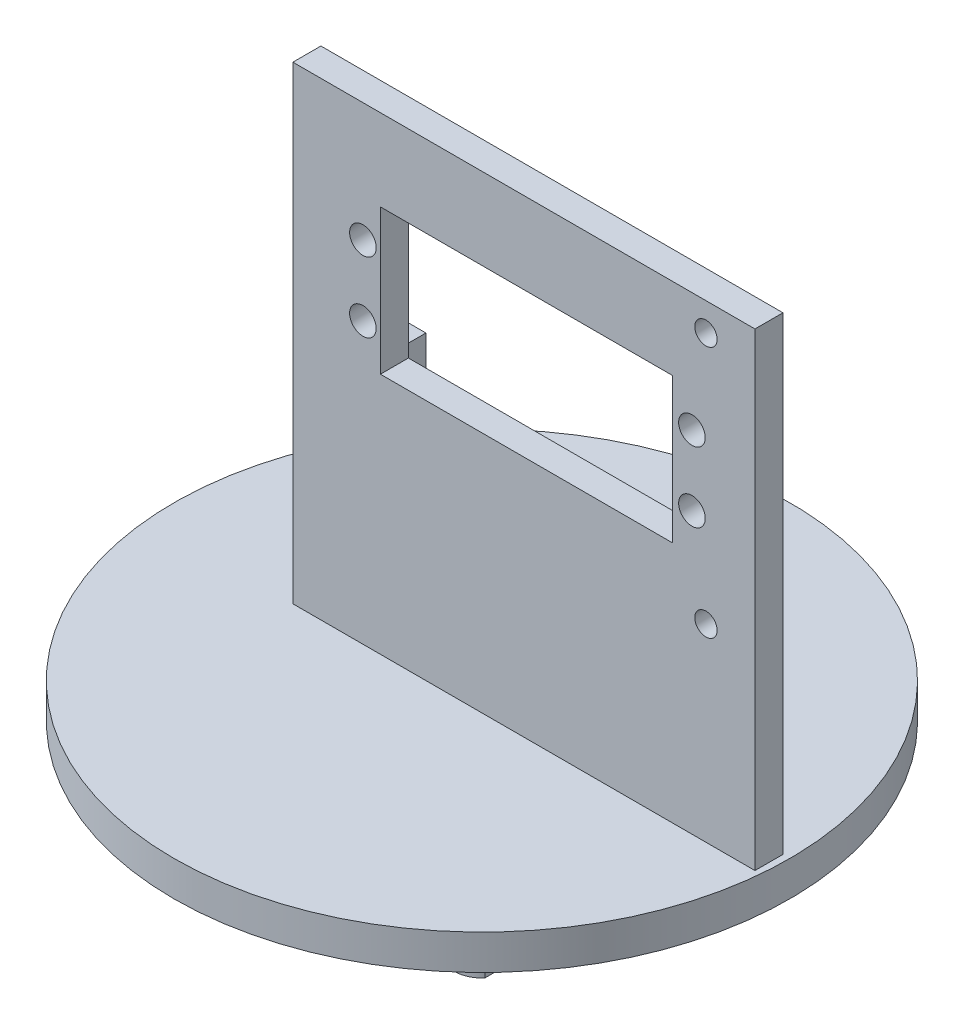
ISO-10303-21;
HEADER;
FILE_DESCRIPTION(('STEP AP214'),'2;1');
FILE_NAME('part.step','',(''),(''),'','','');
FILE_SCHEMA(('AUTOMOTIVE_DESIGN { 1 0 10303 214 1 1 1 1 }'));
ENDSEC;
DATA;
#1=APPLICATION_CONTEXT('core data for automotive mechanical design processes');
#2=APPLICATION_PROTOCOL_DEFINITION('international standard','automotive_design',2000,#1);
#3=PRODUCT_CONTEXT('',#1,'mechanical');
#4=PRODUCT('Part','Part','',(#3));
#5=PRODUCT_RELATED_PRODUCT_CATEGORY('part','',(#4));
#6=PRODUCT_DEFINITION_FORMATION('','',#4);
#7=PRODUCT_DEFINITION_CONTEXT('part definition',#1,'design');
#8=PRODUCT_DEFINITION('design','',#6,#7);
#9=PRODUCT_DEFINITION_SHAPE('','',#8);
#10=(LENGTH_UNIT() NAMED_UNIT(*) SI_UNIT(.MILLI.,.METRE.));
#11=(NAMED_UNIT(*) PLANE_ANGLE_UNIT() SI_UNIT($,.RADIAN.));
#12=(NAMED_UNIT(*) SI_UNIT($,.STERADIAN.) SOLID_ANGLE_UNIT());
#13=UNCERTAINTY_MEASURE_WITH_UNIT(LENGTH_MEASURE(1.E-05),#10,'distance_accuracy_value','');
#14=(GEOMETRIC_REPRESENTATION_CONTEXT(3) GLOBAL_UNCERTAINTY_ASSIGNED_CONTEXT((#13)) GLOBAL_UNIT_ASSIGNED_CONTEXT((#10,
#11,#12)) REPRESENTATION_CONTEXT('',''));
#15=CARTESIAN_POINT('',(0.,0.,0.));
#16=DIRECTION('',(0.,0.,1.));
#17=DIRECTION('',(1.,0.,0.));
#18=AXIS2_PLACEMENT_3D('',#15,#16,#17);
#19=CARTESIAN_POINT('',(0.,0.,0.));
#20=DIRECTION('',(0.,0.,-1.));
#21=DIRECTION('',(-1.,0.,0.));
#22=AXIS2_PLACEMENT_3D('',#19,#20,#21);
#23=PLANE('',#22);
#24=CARTESIAN_POINT('',(36.,104.,0.));
#25=DIRECTION('',(0.,0.,-1.));
#26=DIRECTION('',(-1.,0.,0.));
#27=AXIS2_PLACEMENT_3D('',#24,#25,#26);
#28=CIRCLE('',#27,1.6);
#29=CARTESIAN_POINT('',(34.4,104.,0.));
#30=VERTEX_POINT('',#29);
#31=EDGE_CURVE('E189',#30,#30,#28,.F.);
#32=ORIENTED_EDGE('',*,*,#31,.T.);
#33=EDGE_LOOP('',(#32));
#34=FACE_BOUND('',#33,.T.);
#35=CARTESIAN_POINT('',(36.,140.,0.));
#36=DIRECTION('',(0.,0.,-1.));
#37=DIRECTION('',(-1.,0.,0.));
#38=AXIS2_PLACEMENT_3D('',#35,#36,#37);
#39=CIRCLE('',#38,1.6);
#40=CARTESIAN_POINT('',(34.4,140.,0.));
#41=VERTEX_POINT('',#40);
#42=EDGE_CURVE('E183',#41,#41,#39,.F.);
#43=ORIENTED_EDGE('',*,*,#42,.T.);
#44=EDGE_LOOP('',(#43));
#45=FACE_BOUND('',#44,.T.);
#46=CARTESIAN_POINT('',(-13.,127.,0.));
#47=DIRECTION('',(0.,0.,-1.));
#48=DIRECTION('',(-1.,0.,0.));
#49=AXIS2_PLACEMENT_3D('',#46,#47,#48);
#50=CIRCLE('',#49,1.9);
#51=CARTESIAN_POINT('',(-14.9,127.,0.));
#52=VERTEX_POINT('',#51);
#53=EDGE_CURVE('E209',#52,#52,#50,.F.);
#54=ORIENTED_EDGE('',*,*,#53,.T.);
#55=EDGE_LOOP('',(#54));
#56=FACE_BOUND('',#55,.T.);
#57=CARTESIAN_POINT('',(34.,117.,0.));
#58=DIRECTION('',(0.,0.,-1.));
#59=DIRECTION('',(-1.,0.,0.));
#60=AXIS2_PLACEMENT_3D('',#57,#58,#59);
#61=CIRCLE('',#60,1.9);
#62=CARTESIAN_POINT('',(32.1,117.,0.));
#63=VERTEX_POINT('',#62);
#64=EDGE_CURVE('E202',#63,#63,#61,.F.);
#65=ORIENTED_EDGE('',*,*,#64,.T.);
#66=EDGE_LOOP('',(#65));
#67=FACE_BOUND('',#66,.T.);
#68=CARTESIAN_POINT('',(34.,127.,0.));
#69=DIRECTION('',(0.,0.,-1.));
#70=DIRECTION('',(-1.,0.,0.));
#71=AXIS2_PLACEMENT_3D('',#68,#69,#70);
#72=CIRCLE('',#71,1.9);
#73=CARTESIAN_POINT('',(32.1,127.,0.));
#74=VERTEX_POINT('',#73);
#75=EDGE_CURVE('E199',#74,#74,#72,.F.);
#76=ORIENTED_EDGE('',*,*,#75,.T.);
#77=EDGE_LOOP('',(#76));
#78=FACE_BOUND('',#77,.T.);
#79=CARTESIAN_POINT('',(-13.,117.,0.));
#80=DIRECTION('',(0.,0.,-1.));
#81=DIRECTION('',(-1.,0.,0.));
#82=AXIS2_PLACEMENT_3D('',#79,#80,#81);
#83=CIRCLE('',#82,1.9);
#84=CARTESIAN_POINT('',(-14.9,117.,0.));
#85=VERTEX_POINT('',#84);
#86=EDGE_CURVE('E193',#85,#85,#83,.F.);
#87=ORIENTED_EDGE('',*,*,#86,.T.);
#88=EDGE_LOOP('',(#87));
#89=FACE_BOUND('',#88,.T.);
#90=DIRECTION('',(-1.,0.,0.));
#91=VECTOR('',#90,1.);
#92=CARTESIAN_POINT('',(0.,132.35,0.));
#93=LINE('',#92,#91);
#94=CARTESIAN_POINT('',(31.2,132.35,0.));
#95=VERTEX_POINT('',#94);
#96=CARTESIAN_POINT('',(-10.5,132.35,0.));
#97=VERTEX_POINT('',#96);
#98=EDGE_CURVE('E326',#95,#97,#93,.T.);
#99=ORIENTED_EDGE('',*,*,#98,.T.);
#100=DIRECTION('',(0.,-1.,0.));
#101=VECTOR('',#100,1.);
#102=CARTESIAN_POINT('',(-10.5,0.,0.));
#103=LINE('',#102,#101);
#104=CARTESIAN_POINT('',(-10.5,111.65,0.));
#105=VERTEX_POINT('',#104);
#106=EDGE_CURVE('E185',#97,#105,#103,.T.);
#107=ORIENTED_EDGE('',*,*,#106,.T.);
#108=DIRECTION('',(1.,0.,0.));
#109=VECTOR('',#108,1.);
#110=CARTESIAN_POINT('',(0.,111.65,0.));
#111=LINE('',#110,#109);
#112=CARTESIAN_POINT('',(31.2,111.65,0.));
#113=VERTEX_POINT('',#112);
#114=EDGE_CURVE('E331',#105,#113,#111,.T.);
#115=ORIENTED_EDGE('',*,*,#114,.T.);
#116=DIRECTION('',(0.,1.,0.));
#117=VECTOR('',#116,1.);
#118=CARTESIAN_POINT('',(31.2,0.,0.));
#119=LINE('',#118,#117);
#120=EDGE_CURVE('E329',#113,#95,#119,.T.);
#121=ORIENTED_EDGE('',*,*,#120,.T.);
#122=EDGE_LOOP('',(#99,#107,#115,#121));
#123=FACE_BOUND('',#122,.T.);
#124=DIRECTION('',(-1.,0.,0.));
#125=VECTOR('',#124,1.);
#126=CARTESIAN_POINT('',(0.,77.,0.));
#127=LINE('',#126,#125);
#128=CARTESIAN_POINT('',(43.,77.,0.));
#129=VERTEX_POINT('',#128);
#130=CARTESIAN_POINT('',(-16.,77.,0.));
#131=VERTEX_POINT('',#130);
#132=EDGE_CURVE('E317',#129,#131,#127,.T.);
#133=ORIENTED_EDGE('',*,*,#132,.T.);
#134=DIRECTION('',(0.,1.,0.));
#135=VECTOR('',#134,1.);
#136=CARTESIAN_POINT('',(-16.,0.,0.));
#137=LINE('',#136,#135);
#138=CARTESIAN_POINT('',(-16.,108.,0.));
#139=VERTEX_POINT('',#138);
#140=EDGE_CURVE('E58',#131,#139,#137,.T.);
#141=ORIENTED_EDGE('',*,*,#140,.T.);
#142=DIRECTION('',(-1.,0.,0.));
#143=VECTOR('',#142,1.);
#144=CARTESIAN_POINT('',(0.,108.,0.));
#145=LINE('',#144,#143);
#146=CARTESIAN_POINT('',(-23.,108.,0.));
#147=VERTEX_POINT('',#146);
#148=EDGE_CURVE('E11',#139,#147,#145,.T.);
#149=ORIENTED_EDGE('',*,*,#148,.T.);
#150=DIRECTION('',(0.,-1.,0.));
#151=VECTOR('',#150,1.);
#152=CARTESIAN_POINT('',(-23.,76.,0.));
#153=LINE('',#152,#151);
#154=CARTESIAN_POINT('',(-23.,144.,0.));
#155=VERTEX_POINT('',#154);
#156=EDGE_CURVE('E242',#155,#147,#153,.T.);
#157=ORIENTED_EDGE('',*,*,#156,.F.);
#158=DIRECTION('',(-1.,0.,0.));
#159=VECTOR('',#158,1.);
#160=CARTESIAN_POINT('',(-23.,144.,0.));
#161=LINE('',#160,#159);
#162=CARTESIAN_POINT('',(43.,144.,0.));
#163=VERTEX_POINT('',#162);
#164=EDGE_CURVE('E249',#163,#155,#161,.T.);
#165=ORIENTED_EDGE('',*,*,#164,.F.);
#166=DIRECTION('',(0.,1.,0.));
#167=VECTOR('',#166,1.);
#168=CARTESIAN_POINT('',(43.,76.,0.));
#169=LINE('',#168,#167);
#170=EDGE_CURVE('E260',#129,#163,#169,.T.);
#171=ORIENTED_EDGE('',*,*,#170,.F.);
#172=EDGE_LOOP('',(#133,#141,#149,#157,#165,#171));
#173=FACE_BOUND('',#172,.T.);
#174=ADVANCED_FACE('F44',(#34,#45,#56,#67,#78,#89,#123,#173),#23,.T.);
#175=CARTESIAN_POINT('',(0.,0.,4.));
#176=DIRECTION('',(0.,0.,-1.));
#177=DIRECTION('',(-1.,0.,0.));
#178=AXIS2_PLACEMENT_3D('',#175,#176,#177);
#179=PLANE('',#178);
#180=DIRECTION('',(0.,-1.,0.));
#181=VECTOR('',#180,1.);
#182=CARTESIAN_POINT('',(-23.,76.,4.));
#183=LINE('',#182,#181);
#184=CARTESIAN_POINT('',(-23.,144.,4.));
#185=VERTEX_POINT('',#184);
#186=CARTESIAN_POINT('',(-23.,77.,4.));
#187=VERTEX_POINT('',#186);
#188=EDGE_CURVE('E243',#185,#187,#183,.T.);
#189=ORIENTED_EDGE('',*,*,#188,.T.);
#190=DIRECTION('',(-1.,0.,0.));
#191=VECTOR('',#190,1.);
#192=CARTESIAN_POINT('',(0.,77.,4.));
#193=LINE('',#192,#191);
#194=CARTESIAN_POINT('',(43.,77.,4.));
#195=VERTEX_POINT('',#194);
#196=EDGE_CURVE('E144',#195,#187,#193,.T.);
#197=ORIENTED_EDGE('',*,*,#196,.F.);
#198=DIRECTION('',(0.,1.,0.));
#199=VECTOR('',#198,1.);
#200=CARTESIAN_POINT('',(43.,76.,4.));
#201=LINE('',#200,#199);
#202=CARTESIAN_POINT('',(43.,144.,4.));
#203=VERTEX_POINT('',#202);
#204=EDGE_CURVE('E250',#195,#203,#201,.T.);
#205=ORIENTED_EDGE('',*,*,#204,.T.);
#206=DIRECTION('',(-1.,0.,0.));
#207=VECTOR('',#206,1.);
#208=CARTESIAN_POINT('',(-23.,144.,4.));
#209=LINE('',#208,#207);
#210=EDGE_CURVE('E253',#203,#185,#209,.T.);
#211=ORIENTED_EDGE('',*,*,#210,.T.);
#212=EDGE_LOOP('',(#189,#197,#205,#211));
#213=FACE_BOUND('',#212,.T.);
#214=DIRECTION('',(0.,-1.,0.));
#215=VECTOR('',#214,1.);
#216=CARTESIAN_POINT('',(-10.5,0.,4.));
#217=LINE('',#216,#215);
#218=CARTESIAN_POINT('',(-10.5,132.35,4.));
#219=VERTEX_POINT('',#218);
#220=CARTESIAN_POINT('',(-10.5,111.65,4.));
#221=VERTEX_POINT('',#220);
#222=EDGE_CURVE('E238',#219,#221,#217,.T.);
#223=ORIENTED_EDGE('',*,*,#222,.F.);
#224=DIRECTION('',(-1.,0.,0.));
#225=VECTOR('',#224,1.);
#226=CARTESIAN_POINT('',(0.,132.35,4.));
#227=LINE('',#226,#225);
#228=CARTESIAN_POINT('',(31.2,132.35,4.));
#229=VERTEX_POINT('',#228);
#230=EDGE_CURVE('E229',#229,#219,#227,.T.);
#231=ORIENTED_EDGE('',*,*,#230,.F.);
#232=DIRECTION('',(0.,1.,0.));
#233=VECTOR('',#232,1.);
#234=CARTESIAN_POINT('',(31.2,0.,4.));
#235=LINE('',#234,#233);
#236=CARTESIAN_POINT('',(31.2,111.65,4.));
#237=VERTEX_POINT('',#236);
#238=EDGE_CURVE('E234',#237,#229,#235,.T.);
#239=ORIENTED_EDGE('',*,*,#238,.F.);
#240=DIRECTION('',(1.,0.,0.));
#241=VECTOR('',#240,1.);
#242=CARTESIAN_POINT('',(0.,111.65,4.));
#243=LINE('',#242,#241);
#244=EDGE_CURVE('E240',#221,#237,#243,.T.);
#245=ORIENTED_EDGE('',*,*,#244,.F.);
#246=EDGE_LOOP('',(#223,#231,#239,#245));
#247=FACE_BOUND('',#246,.T.);
#248=CARTESIAN_POINT('',(-13.,117.,4.));
#249=DIRECTION('',(0.,0.,-1.));
#250=DIRECTION('',(-1.,0.,0.));
#251=AXIS2_PLACEMENT_3D('',#248,#249,#250);
#252=CIRCLE('',#251,1.9);
#253=CARTESIAN_POINT('',(-14.9,117.,4.));
#254=VERTEX_POINT('',#253);
#255=EDGE_CURVE('E198',#254,#254,#252,.F.);
#256=ORIENTED_EDGE('',*,*,#255,.F.);
#257=EDGE_LOOP('',(#256));
#258=FACE_BOUND('',#257,.T.);
#259=CARTESIAN_POINT('',(34.,127.,4.));
#260=DIRECTION('',(0.,0.,-1.));
#261=DIRECTION('',(-1.,0.,0.));
#262=AXIS2_PLACEMENT_3D('',#259,#260,#261);
#263=CIRCLE('',#262,1.9);
#264=CARTESIAN_POINT('',(32.1,127.,4.));
#265=VERTEX_POINT('',#264);
#266=EDGE_CURVE('E203',#265,#265,#263,.F.);
#267=ORIENTED_EDGE('',*,*,#266,.F.);
#268=EDGE_LOOP('',(#267));
#269=FACE_BOUND('',#268,.T.);
#270=CARTESIAN_POINT('',(34.,117.,4.));
#271=DIRECTION('',(0.,0.,-1.));
#272=DIRECTION('',(-1.,0.,0.));
#273=AXIS2_PLACEMENT_3D('',#270,#271,#272);
#274=CIRCLE('',#273,1.9);
#275=CARTESIAN_POINT('',(32.1,117.,4.));
#276=VERTEX_POINT('',#275);
#277=EDGE_CURVE('E206',#276,#276,#274,.F.);
#278=ORIENTED_EDGE('',*,*,#277,.F.);
#279=EDGE_LOOP('',(#278));
#280=FACE_BOUND('',#279,.T.);
#281=CARTESIAN_POINT('',(-13.,127.,4.));
#282=DIRECTION('',(0.,0.,-1.));
#283=DIRECTION('',(-1.,0.,0.));
#284=AXIS2_PLACEMENT_3D('',#281,#282,#283);
#285=CIRCLE('',#284,1.9);
#286=CARTESIAN_POINT('',(-14.9,127.,4.));
#287=VERTEX_POINT('',#286);
#288=EDGE_CURVE('E211',#287,#287,#285,.F.);
#289=ORIENTED_EDGE('',*,*,#288,.F.);
#290=EDGE_LOOP('',(#289));
#291=FACE_BOUND('',#290,.T.);
#292=CARTESIAN_POINT('',(36.,140.,4.));
#293=DIRECTION('',(0.,0.,-1.));
#294=DIRECTION('',(-1.,0.,0.));
#295=AXIS2_PLACEMENT_3D('',#292,#293,#294);
#296=CIRCLE('',#295,1.6);
#297=CARTESIAN_POINT('',(34.4,140.,4.));
#298=VERTEX_POINT('',#297);
#299=EDGE_CURVE('E186',#298,#298,#296,.F.);
#300=ORIENTED_EDGE('',*,*,#299,.F.);
#301=EDGE_LOOP('',(#300));
#302=FACE_BOUND('',#301,.T.);
#303=CARTESIAN_POINT('',(36.,104.,4.));
#304=DIRECTION('',(0.,0.,-1.));
#305=DIRECTION('',(-1.,0.,0.));
#306=AXIS2_PLACEMENT_3D('',#303,#304,#305);
#307=CIRCLE('',#306,1.6);
#308=CARTESIAN_POINT('',(34.4,104.,4.));
#309=VERTEX_POINT('',#308);
#310=EDGE_CURVE('E192',#309,#309,#307,.F.);
#311=ORIENTED_EDGE('',*,*,#310,.F.);
#312=EDGE_LOOP('',(#311));
#313=FACE_BOUND('',#312,.T.);
#314=ADVANCED_FACE('F369',(#213,#247,#258,#269,#280,#291,#302,#313),#179,.F.);
#315=CARTESIAN_POINT('',(0.,77.,0.));
#316=DIRECTION('',(0.,1.,0.));
#317=DIRECTION('',(0.,0.,1.));
#318=AXIS2_PLACEMENT_3D('',#315,#316,#317);
#319=PLANE('',#318);
#320=DIRECTION('',(0.,0.,-1.));
#321=VECTOR('',#320,1.);
#322=CARTESIAN_POINT('',(-16.,77.,4.));
#323=LINE('',#322,#321);
#324=CARTESIAN_POINT('',(-16.,77.,-8.));
#325=VERTEX_POINT('',#324);
#326=EDGE_CURVE('E53',#131,#325,#323,.T.);
#327=ORIENTED_EDGE('',*,*,#326,.F.);
#328=ORIENTED_EDGE('',*,*,#132,.F.);
#329=DIRECTION('',(0.,0.,1.));
#330=VECTOR('',#329,1.);
#331=CARTESIAN_POINT('',(43.,77.,0.));
#332=LINE('',#331,#330);
#333=EDGE_CURVE('E151',#129,#195,#332,.T.);
#334=ORIENTED_EDGE('',*,*,#333,.T.);
#335=ORIENTED_EDGE('',*,*,#196,.T.);
#336=DIRECTION('',(0.,0.,-1.));
#337=VECTOR('',#336,1.);
#338=CARTESIAN_POINT('',(-23.,77.,0.));
#339=LINE('',#338,#337);
#340=CARTESIAN_POINT('',(-23.,77.,-8.));
#341=VERTEX_POINT('',#340);
#342=EDGE_CURVE('E139',#187,#341,#339,.T.);
#343=ORIENTED_EDGE('',*,*,#342,.T.);
#344=DIRECTION('',(1.,0.,0.));
#345=VECTOR('',#344,1.);
#346=CARTESIAN_POINT('',(-23.,77.,-8.));
#347=LINE('',#346,#345);
#348=EDGE_CURVE('E142',#341,#325,#347,.T.);
#349=ORIENTED_EDGE('',*,*,#348,.T.);
#350=EDGE_LOOP('',(#327,#328,#334,#335,#343,#349));
#351=FACE_BOUND('',#350,.T.);
#352=CARTESIAN_POINT('',(0.,77.,0.));
#353=DIRECTION('',(0.,1.,0.));
#354=DIRECTION('',(0.,0.,1.));
#355=AXIS2_PLACEMENT_3D('',#352,#353,#354);
#356=CIRCLE('',#355,44.);
#357=CARTESIAN_POINT('',(0.,77.,44.));
#358=VERTEX_POINT('',#357);
#359=EDGE_CURVE('E298',#358,#358,#356,.T.);
#360=ORIENTED_EDGE('',*,*,#359,.T.);
#361=EDGE_LOOP('',(#360));
#362=FACE_BOUND('',#361,.T.);
#363=ADVANCED_FACE('F138',(#351,#362),#319,.T.);
#364=CARTESIAN_POINT('',(0.,72.,0.));
#365=DIRECTION('',(0.,-1.,0.));
#366=DIRECTION('',(0.,0.,-1.));
#367=AXIS2_PLACEMENT_3D('',#364,#365,#366);
#368=CYLINDRICAL_SURFACE('',#367,3.95);
#369=CARTESIAN_POINT('',(0.,70.,0.));
#370=DIRECTION('',(0.,1.,0.));
#371=DIRECTION('',(0.,0.,1.));
#372=AXIS2_PLACEMENT_3D('',#369,#370,#371);
#373=CIRCLE('',#372,3.95);
#374=CARTESIAN_POINT('',(0.,70.,3.95));
#375=VERTEX_POINT('',#374);
#376=EDGE_CURVE('E292',#375,#375,#373,.T.);
#377=ORIENTED_EDGE('',*,*,#376,.F.);
#378=EDGE_LOOP('',(#377));
#379=FACE_BOUND('',#378,.T.);
#380=DIRECTION('',(0.,-1.,0.));
#381=VECTOR('',#380,1.);
#382=CARTESIAN_POINT('',(3.,72.,2.56953303150592));
#383=LINE('',#382,#381);
#384=CARTESIAN_POINT('',(3.,48.,2.56953303150592));
#385=VERTEX_POINT('',#384);
#386=CARTESIAN_POINT('',(3.,43.,2.56953303150592));
#387=VERTEX_POINT('',#386);
#388=EDGE_CURVE('E282',#385,#387,#383,.T.);
#389=ORIENTED_EDGE('',*,*,#388,.F.);
#390=CARTESIAN_POINT('',(0.,48.,0.));
#391=DIRECTION('',(0.,-1.,0.));
#392=DIRECTION('',(0.,0.,-1.));
#393=AXIS2_PLACEMENT_3D('',#390,#391,#392);
#394=CIRCLE('',#393,3.95);
#395=CARTESIAN_POINT('',(3.,48.,-2.56953303150592));
#396=VERTEX_POINT('',#395);
#397=EDGE_CURVE('E279',#396,#385,#394,.T.);
#398=ORIENTED_EDGE('',*,*,#397,.F.);
#399=DIRECTION('',(0.,-1.,0.));
#400=VECTOR('',#399,1.);
#401=CARTESIAN_POINT('',(3.,72.,-2.56953303150592));
#402=LINE('',#401,#400);
#403=CARTESIAN_POINT('',(3.,43.,-2.56953303150592));
#404=VERTEX_POINT('',#403);
#405=EDGE_CURVE('E272',#404,#396,#402,.F.);
#406=ORIENTED_EDGE('',*,*,#405,.F.);
#407=CARTESIAN_POINT('',(0.,43.,0.));
#408=DIRECTION('',(0.,1.,0.));
#409=DIRECTION('',(0.,0.,1.));
#410=AXIS2_PLACEMENT_3D('',#407,#408,#409);
#411=CIRCLE('',#410,3.95);
#412=EDGE_CURVE('E304',#404,#387,#411,.T.);
#413=ORIENTED_EDGE('',*,*,#412,.T.);
#414=EDGE_LOOP('',(#389,#398,#406,#413));
#415=FACE_BOUND('',#414,.T.);
#416=ADVANCED_FACE('F380',(#379,#415),#368,.T.);
#417=CARTESIAN_POINT('',(0.,43.,0.));
#418=DIRECTION('',(0.,1.,0.));
#419=DIRECTION('',(0.,0.,1.));
#420=AXIS2_PLACEMENT_3D('',#417,#418,#419);
#421=PLANE('',#420);
#422=ORIENTED_EDGE('',*,*,#412,.F.);
#423=DIRECTION('',(0.,0.,1.));
#424=VECTOR('',#423,1.);
#425=CARTESIAN_POINT('',(3.,43.,5.));
#426=LINE('',#425,#424);
#427=EDGE_CURVE('E273',#404,#387,#426,.T.);
#428=ORIENTED_EDGE('',*,*,#427,.T.);
#429=EDGE_LOOP('',(#422,#428));
#430=FACE_BOUND('',#429,.T.);
#431=CARTESIAN_POINT('',(0.,43.,0.));
#432=DIRECTION('',(0.,1.,0.));
#433=DIRECTION('',(0.,0.,1.));
#434=AXIS2_PLACEMENT_3D('',#431,#432,#433);
#435=CIRCLE('',#434,1.75);
#436=CARTESIAN_POINT('',(0.,43.,-1.75));
#437=VERTEX_POINT('',#436);
#438=EDGE_CURVE('E288',#437,#437,#435,.T.);
#439=ORIENTED_EDGE('',*,*,#438,.T.);
#440=EDGE_LOOP('',(#439));
#441=FACE_BOUND('',#440,.T.);
#442=ADVANCED_FACE('F418',(#430,#441),#421,.F.);
#443=CARTESIAN_POINT('',(0.,72.,0.));
#444=DIRECTION('',(0.,-1.,0.));
#445=DIRECTION('',(0.,0.,-1.));
#446=AXIS2_PLACEMENT_3D('',#443,#444,#445);
#447=CYLINDRICAL_SURFACE('',#446,1.75);
#448=CARTESIAN_POINT('',(0.,72.,0.));
#449=DIRECTION('',(0.,1.,0.));
#450=DIRECTION('',(0.,0.,1.));
#451=AXIS2_PLACEMENT_3D('',#448,#449,#450);
#452=CIRCLE('',#451,1.75);
#453=CARTESIAN_POINT('',(0.,72.,-1.75));
#454=VERTEX_POINT('',#453);
#455=EDGE_CURVE('E293',#454,#454,#452,.T.);
#456=CARTESIAN_POINT('',(0.,72.,-1.75));
#457=CARTESIAN_POINT('',(0.,71.6979166666667,-1.75));
#458=CARTESIAN_POINT('',(0.,71.3958333333333,-1.75));
#459=CARTESIAN_POINT('',(0.,70.7916666666667,-1.75));
#460=CARTESIAN_POINT('',(0.,70.4895833333333,-1.75));
#461=CARTESIAN_POINT('',(0.,69.8854166666667,-1.75));
#462=CARTESIAN_POINT('',(0.,69.5833333333333,-1.75));
#463=CARTESIAN_POINT('',(0.,68.9791666666667,-1.75));
#464=CARTESIAN_POINT('',(0.,68.6770833333333,-1.75));
#465=CARTESIAN_POINT('',(0.,68.0729166666667,-1.75));
#466=CARTESIAN_POINT('',(0.,67.7708333333333,-1.75));
#467=CARTESIAN_POINT('',(0.,67.1666666666667,-1.75));
#468=CARTESIAN_POINT('',(0.,66.8645833333333,-1.75));
#469=CARTESIAN_POINT('',(0.,66.2604166666667,-1.75));
#470=CARTESIAN_POINT('',(0.,65.9583333333333,-1.75));
#471=CARTESIAN_POINT('',(0.,65.3541666666667,-1.75));
#472=CARTESIAN_POINT('',(0.,65.0520833333333,-1.75));
#473=CARTESIAN_POINT('',(0.,64.4479166666667,-1.75));
#474=CARTESIAN_POINT('',(0.,64.1458333333333,-1.75));
#475=CARTESIAN_POINT('',(0.,63.5416666666667,-1.75));
#476=CARTESIAN_POINT('',(0.,63.2395833333333,-1.75));
#477=CARTESIAN_POINT('',(0.,62.6354166666667,-1.75));
#478=CARTESIAN_POINT('',(0.,62.3333333333333,-1.75));
#479=CARTESIAN_POINT('',(0.,61.7291666666667,-1.75));
#480=CARTESIAN_POINT('',(0.,61.4270833333333,-1.75));
#481=CARTESIAN_POINT('',(0.,60.8229166666667,-1.75));
#482=CARTESIAN_POINT('',(0.,60.5208333333333,-1.75));
#483=CARTESIAN_POINT('',(0.,59.9166666666667,-1.75));
#484=CARTESIAN_POINT('',(0.,59.6145833333333,-1.75));
#485=CARTESIAN_POINT('',(0.,59.0104166666667,-1.75));
#486=CARTESIAN_POINT('',(0.,58.7083333333333,-1.75));
#487=CARTESIAN_POINT('',(0.,58.1041666666667,-1.75));
#488=CARTESIAN_POINT('',(0.,57.8020833333333,-1.75));
#489=CARTESIAN_POINT('',(0.,57.1979166666667,-1.75));
#490=CARTESIAN_POINT('',(0.,56.8958333333333,-1.75));
#491=CARTESIAN_POINT('',(0.,56.2916666666667,-1.75));
#492=CARTESIAN_POINT('',(0.,55.9895833333333,-1.75));
#493=CARTESIAN_POINT('',(0.,55.3854166666667,-1.75));
#494=CARTESIAN_POINT('',(0.,55.0833333333333,-1.75));
#495=CARTESIAN_POINT('',(0.,54.4791666666667,-1.75));
#496=CARTESIAN_POINT('',(0.,54.1770833333333,-1.75));
#497=CARTESIAN_POINT('',(0.,53.5729166666667,-1.75));
#498=CARTESIAN_POINT('',(0.,53.2708333333333,-1.75));
#499=CARTESIAN_POINT('',(0.,52.6666666666667,-1.75));
#500=CARTESIAN_POINT('',(0.,52.3645833333333,-1.75));
#501=CARTESIAN_POINT('',(0.,51.7604166666667,-1.75));
#502=CARTESIAN_POINT('',(0.,51.4583333333333,-1.75));
#503=CARTESIAN_POINT('',(0.,50.8541666666667,-1.75));
#504=CARTESIAN_POINT('',(0.,50.5520833333333,-1.75));
#505=CARTESIAN_POINT('',(0.,49.9479166666667,-1.75));
#506=CARTESIAN_POINT('',(0.,49.6458333333333,-1.75));
#507=CARTESIAN_POINT('',(0.,49.0416666666667,-1.75));
#508=CARTESIAN_POINT('',(0.,48.7395833333333,-1.75));
#509=CARTESIAN_POINT('',(0.,48.1354166666667,-1.75));
#510=CARTESIAN_POINT('',(0.,47.8333333333333,-1.75));
#511=CARTESIAN_POINT('',(0.,47.2291666666667,-1.75));
#512=CARTESIAN_POINT('',(0.,46.9270833333333,-1.75));
#513=CARTESIAN_POINT('',(0.,46.3229166666667,-1.75));
#514=CARTESIAN_POINT('',(0.,46.0208333333333,-1.75));
#515=CARTESIAN_POINT('',(0.,45.4166666666667,-1.75));
#516=CARTESIAN_POINT('',(0.,45.1145833333333,-1.75));
#517=CARTESIAN_POINT('',(0.,44.5104166666667,-1.75));
#518=CARTESIAN_POINT('',(0.,44.2083333333333,-1.75));
#519=CARTESIAN_POINT('',(0.,43.6041666666667,-1.75));
#520=CARTESIAN_POINT('',(0.,43.3020833333333,-1.75));
#521=CARTESIAN_POINT('',(0.,43.,-1.75));
#522=B_SPLINE_CURVE_WITH_KNOTS('',3,(#456,#457,#458,#459,#460,#461,#462,#463,#464,#465,#466,
#467,#468,#469,#470,#471,#472,#473,#474,#475,#476,#477,#478,#479,#480,#481,#482,#483,#484,#485,
#486,#487,#488,#489,#490,#491,#492,#493,#494,#495,#496,#497,#498,#499,#500,#501,#502,#503,#504,
#505,#506,#507,#508,#509,#510,#511,#512,#513,#514,#515,#516,#517,#518,#519,#520,#521),
.UNSPECIFIED.,.F.,.F.,(4,2,2,2,2,2,2,2,2,2,2,2,2,2,2,2,2,2,2,2,2,2,2,2,2,2,2,2,2,2,2,2,4),(0.,
0.906250000000011,1.81250000000001,2.71875000000001,3.625,4.53125,5.43750000000001,
6.34375000000001,7.25000000000001,8.15625,9.0625,9.96875000000001,10.875,11.78125,12.6875,
13.59375,14.5,15.40625,16.3125,17.21875,18.125,19.03125,19.9375,20.84375,21.75,22.65625,23.5625,
24.46875,25.375,26.28125,27.1875,28.09375,29.),.UNSPECIFIED.);
#523=EDGE_CURVE('BSEAM414',#454,#437,#522,.T.);
#524=ORIENTED_EDGE('',*,*,#455,.T.);
#525=ORIENTED_EDGE('',*,*,#438,.F.);
#526=ORIENTED_EDGE('',*,*,#523,.T.);
#527=ORIENTED_EDGE('',*,*,#523,.F.);
#528=EDGE_LOOP('',(#524,#526,#525,#527));
#529=FACE_BOUND('',#528,.T.);
#530=ADVANCED_FACE('F414',(#529),#447,.F.);
#531=CARTESIAN_POINT('',(0.,72.,0.));
#532=DIRECTION('',(0.,1.,0.));
#533=DIRECTION('',(0.,0.,1.));
#534=AXIS2_PLACEMENT_3D('',#531,#532,#533);
#535=PLANE('',#534);
#536=ORIENTED_EDGE('',*,*,#455,.F.);
#537=EDGE_LOOP('',(#536));
#538=FACE_BOUND('',#537,.T.);
#539=ADVANCED_FACE('F407',(#538),#535,.F.);
#540=CARTESIAN_POINT('',(0.,70.,0.));
#541=DIRECTION('',(0.,1.,0.));
#542=DIRECTION('',(0.,0.,1.));
#543=AXIS2_PLACEMENT_3D('',#540,#541,#542);
#544=PLANE('',#543);
#545=CARTESIAN_POINT('',(0.,70.,0.));
#546=DIRECTION('',(0.,1.,0.));
#547=DIRECTION('',(0.,0.,1.));
#548=AXIS2_PLACEMENT_3D('',#545,#546,#547);
#549=CIRCLE('',#548,6.);
#550=CARTESIAN_POINT('',(0.,70.,6.));
#551=VERTEX_POINT('',#550);
#552=EDGE_CURVE('E287',#551,#551,#549,.T.);
#553=ORIENTED_EDGE('',*,*,#552,.F.);
#554=EDGE_LOOP('',(#553));
#555=FACE_BOUND('',#554,.T.);
#556=ORIENTED_EDGE('',*,*,#376,.T.);
#557=EDGE_LOOP('',(#556));
#558=FACE_BOUND('',#557,.T.);
#559=ADVANCED_FACE('F404',(#555,#558),#544,.F.);
#560=CARTESIAN_POINT('',(0.,72.,0.));
#561=DIRECTION('',(0.,-1.,0.));
#562=DIRECTION('',(0.,0.,-1.));
#563=AXIS2_PLACEMENT_3D('',#560,#561,#562);
#564=CYLINDRICAL_SURFACE('',#563,6.);
#565=CARTESIAN_POINT('',(0.,72.,0.));
#566=DIRECTION('',(0.,1.,0.));
#567=DIRECTION('',(0.,0.,1.));
#568=AXIS2_PLACEMENT_3D('',#565,#566,#567);
#569=CIRCLE('',#568,6.);
#570=CARTESIAN_POINT('',(0.,72.,6.));
#571=VERTEX_POINT('',#570);
#572=EDGE_CURVE('E276',#571,#571,#569,.F.);
#573=ORIENTED_EDGE('',*,*,#572,.T.);
#574=EDGE_LOOP('',(#573));
#575=FACE_BOUND('',#574,.T.);
#576=ORIENTED_EDGE('',*,*,#552,.T.);
#577=EDGE_LOOP('',(#576));
#578=FACE_BOUND('',#577,.T.);
#579=ADVANCED_FACE('F410',(#575,#578),#564,.T.);
#580=CARTESIAN_POINT('',(0.,77.,0.));
#581=DIRECTION('',(0.,-1.,0.));
#582=DIRECTION('',(0.,0.,-1.));
#583=AXIS2_PLACEMENT_3D('',#580,#581,#582);
#584=CYLINDRICAL_SURFACE('',#583,44.);
#585=ORIENTED_EDGE('',*,*,#359,.F.);
#586=EDGE_LOOP('',(#585));
#587=FACE_BOUND('',#586,.T.);
#588=CARTESIAN_POINT('',(0.,72.,0.));
#589=DIRECTION('',(0.,1.,0.));
#590=DIRECTION('',(0.,0.,1.));
#591=AXIS2_PLACEMENT_3D('',#588,#589,#590);
#592=CIRCLE('',#591,44.);
#593=CARTESIAN_POINT('',(0.,72.,44.));
#594=VERTEX_POINT('',#593);
#595=EDGE_CURVE('E307',#594,#594,#592,.T.);
#596=ORIENTED_EDGE('',*,*,#595,.T.);
#597=EDGE_LOOP('',(#596));
#598=FACE_BOUND('',#597,.T.);
#599=ADVANCED_FACE('F50',(#587,#598),#584,.T.);
#600=ORIENTED_EDGE('',*,*,#572,.F.);
#601=EDGE_LOOP('',(#600));
#602=FACE_BOUND('',#601,.T.);
#603=ORIENTED_EDGE('',*,*,#595,.F.);
#604=EDGE_LOOP('',(#603));
#605=FACE_BOUND('',#604,.T.);
#606=ADVANCED_FACE('F396',(#602,#605),#535,.F.);
#607=CARTESIAN_POINT('',(0.,48.,0.));
#608=DIRECTION('',(0.,-1.,0.));
#609=DIRECTION('',(0.,0.,-1.));
#610=AXIS2_PLACEMENT_3D('',#607,#608,#609);
#611=PLANE('',#610);
#612=ORIENTED_EDGE('',*,*,#397,.T.);
#613=DIRECTION('',(0.,0.,1.));
#614=VECTOR('',#613,1.);
#615=CARTESIAN_POINT('',(3.,48.,5.));
#616=LINE('',#615,#614);
#617=EDGE_CURVE('E267',#396,#385,#616,.T.);
#618=ORIENTED_EDGE('',*,*,#617,.F.);
#619=EDGE_LOOP('',(#612,#618));
#620=FACE_BOUND('',#619,.T.);
#621=ADVANCED_FACE('F397',(#620),#611,.T.);
#622=CARTESIAN_POINT('',(3.,48.,5.));
#623=DIRECTION('',(1.,0.,0.));
#624=DIRECTION('',(0.,0.,-1.));
#625=AXIS2_PLACEMENT_3D('',#622,#623,#624);
#626=PLANE('',#625);
#627=ORIENTED_EDGE('',*,*,#388,.T.);
#628=ORIENTED_EDGE('',*,*,#427,.F.);
#629=ORIENTED_EDGE('',*,*,#405,.T.);
#630=ORIENTED_EDGE('',*,*,#617,.T.);
#631=EDGE_LOOP('',(#627,#628,#629,#630));
#632=FACE_BOUND('',#631,.T.);
#633=ADVANCED_FACE('F394',(#632),#626,.T.);
#634=CARTESIAN_POINT('',(-23.,76.,4.));
#635=DIRECTION('',(1.,0.,0.));
#636=DIRECTION('',(0.,0.,-1.));
#637=AXIS2_PLACEMENT_3D('',#634,#635,#636);
#638=PLANE('',#637);
#639=ORIENTED_EDGE('',*,*,#342,.F.);
#640=ORIENTED_EDGE('',*,*,#188,.F.);
#641=DIRECTION('',(0.,0.,-1.));
#642=VECTOR('',#641,1.);
#643=CARTESIAN_POINT('',(-23.,144.,4.));
#644=LINE('',#643,#642);
#645=EDGE_CURVE('E255',#185,#155,#644,.T.);
#646=ORIENTED_EDGE('',*,*,#645,.T.);
#647=ORIENTED_EDGE('',*,*,#156,.T.);
#648=DIRECTION('',(0.,0.,-1.));
#649=VECTOR('',#648,1.);
#650=CARTESIAN_POINT('',(-23.,108.,4.));
#651=LINE('',#650,#649);
#652=CARTESIAN_POINT('',(-23.,108.,-8.));
#653=VERTEX_POINT('',#652);
#654=EDGE_CURVE('E164',#147,#653,#651,.T.);
#655=ORIENTED_EDGE('',*,*,#654,.T.);
#656=DIRECTION('',(0.,-1.,0.));
#657=VECTOR('',#656,1.);
#658=CARTESIAN_POINT('',(-23.,77.,-8.));
#659=LINE('',#658,#657);
#660=EDGE_CURVE('E158',#653,#341,#659,.T.);
#661=ORIENTED_EDGE('',*,*,#660,.T.);
#662=EDGE_LOOP('',(#639,#640,#646,#647,#655,#661));
#663=FACE_BOUND('',#662,.T.);
#664=ADVANCED_FACE('F162',(#663),#638,.F.);
#665=CARTESIAN_POINT('',(43.,76.,4.));
#666=DIRECTION('',(-1.,0.,0.));
#667=DIRECTION('',(0.,0.,1.));
#668=AXIS2_PLACEMENT_3D('',#665,#666,#667);
#669=PLANE('',#668);
#670=ORIENTED_EDGE('',*,*,#333,.F.);
#671=ORIENTED_EDGE('',*,*,#170,.T.);
#672=DIRECTION('',(0.,0.,-1.));
#673=VECTOR('',#672,1.);
#674=CARTESIAN_POINT('',(43.,144.,4.));
#675=LINE('',#674,#673);
#676=EDGE_CURVE('E264',#203,#163,#675,.T.);
#677=ORIENTED_EDGE('',*,*,#676,.F.);
#678=ORIENTED_EDGE('',*,*,#204,.F.);
#679=EDGE_LOOP('',(#670,#671,#677,#678));
#680=FACE_BOUND('',#679,.T.);
#681=ADVANCED_FACE('F389',(#680),#669,.F.);
#682=CARTESIAN_POINT('',(-23.,144.,4.));
#683=DIRECTION('',(0.,-1.,0.));
#684=DIRECTION('',(0.,0.,-1.));
#685=AXIS2_PLACEMENT_3D('',#682,#683,#684);
#686=PLANE('',#685);
#687=ORIENTED_EDGE('',*,*,#164,.T.);
#688=ORIENTED_EDGE('',*,*,#645,.F.);
#689=ORIENTED_EDGE('',*,*,#210,.F.);
#690=ORIENTED_EDGE('',*,*,#676,.T.);
#691=EDGE_LOOP('',(#687,#688,#689,#690));
#692=FACE_BOUND('',#691,.T.);
#693=ADVANCED_FACE('F384',(#692),#686,.F.);
#694=CARTESIAN_POINT('',(-10.5,111.65,44.));
#695=DIRECTION('',(1.,0.,0.));
#696=DIRECTION('',(0.,0.,-1.));
#697=AXIS2_PLACEMENT_3D('',#694,#695,#696);
#698=PLANE('',#697);
#699=ORIENTED_EDGE('',*,*,#222,.T.);
#700=DIRECTION('',(0.,0.,-1.));
#701=VECTOR('',#700,1.);
#702=CARTESIAN_POINT('',(-10.5,111.65,44.));
#703=LINE('',#702,#701);
#704=EDGE_CURVE('E226',#221,#105,#703,.T.);
#705=ORIENTED_EDGE('',*,*,#704,.T.);
#706=ORIENTED_EDGE('',*,*,#106,.F.);
#707=DIRECTION('',(0.,0.,-1.));
#708=VECTOR('',#707,1.);
#709=CARTESIAN_POINT('',(-10.5,132.35,44.));
#710=LINE('',#709,#708);
#711=EDGE_CURVE('E214',#219,#97,#710,.T.);
#712=ORIENTED_EDGE('',*,*,#711,.F.);
#713=EDGE_LOOP('',(#699,#705,#706,#712));
#714=FACE_BOUND('',#713,.T.);
#715=ADVANCED_FACE('F385',(#714),#698,.T.);
#716=CARTESIAN_POINT('',(-10.5,111.65,44.));
#717=DIRECTION('',(0.,1.,0.));
#718=DIRECTION('',(0.,0.,1.));
#719=AXIS2_PLACEMENT_3D('',#716,#717,#718);
#720=PLANE('',#719);
#721=ORIENTED_EDGE('',*,*,#244,.T.);
#722=DIRECTION('',(0.,0.,-1.));
#723=VECTOR('',#722,1.);
#724=CARTESIAN_POINT('',(31.2,111.65,44.));
#725=LINE('',#724,#723);
#726=EDGE_CURVE('E225',#237,#113,#725,.T.);
#727=ORIENTED_EDGE('',*,*,#726,.T.);
#728=ORIENTED_EDGE('',*,*,#114,.F.);
#729=ORIENTED_EDGE('',*,*,#704,.F.);
#730=EDGE_LOOP('',(#721,#727,#728,#729));
#731=FACE_BOUND('',#730,.T.);
#732=ADVANCED_FACE('F520',(#731),#720,.T.);
#733=CARTESIAN_POINT('',(31.2,111.65,44.));
#734=DIRECTION('',(-1.,0.,0.));
#735=DIRECTION('',(0.,0.,1.));
#736=AXIS2_PLACEMENT_3D('',#733,#734,#735);
#737=PLANE('',#736);
#738=ORIENTED_EDGE('',*,*,#238,.T.);
#739=DIRECTION('',(0.,0.,-1.));
#740=VECTOR('',#739,1.);
#741=CARTESIAN_POINT('',(31.2,132.35,44.));
#742=LINE('',#741,#740);
#743=EDGE_CURVE('E217',#229,#95,#742,.T.);
#744=ORIENTED_EDGE('',*,*,#743,.T.);
#745=ORIENTED_EDGE('',*,*,#120,.F.);
#746=ORIENTED_EDGE('',*,*,#726,.F.);
#747=EDGE_LOOP('',(#738,#744,#745,#746));
#748=FACE_BOUND('',#747,.T.);
#749=ADVANCED_FACE('F528',(#748),#737,.T.);
#750=CARTESIAN_POINT('',(-10.5,132.35,44.));
#751=DIRECTION('',(0.,-1.,0.));
#752=DIRECTION('',(0.,0.,-1.));
#753=AXIS2_PLACEMENT_3D('',#750,#751,#752);
#754=PLANE('',#753);
#755=ORIENTED_EDGE('',*,*,#230,.T.);
#756=ORIENTED_EDGE('',*,*,#711,.T.);
#757=ORIENTED_EDGE('',*,*,#98,.F.);
#758=ORIENTED_EDGE('',*,*,#743,.F.);
#759=EDGE_LOOP('',(#755,#756,#757,#758));
#760=FACE_BOUND('',#759,.T.);
#761=ADVANCED_FACE('F532',(#760),#754,.T.);
#762=CARTESIAN_POINT('',(-13.,117.,44.));
#763=DIRECTION('',(0.,0.,-1.));
#764=DIRECTION('',(-1.,0.,0.));
#765=AXIS2_PLACEMENT_3D('',#762,#763,#764);
#766=CYLINDRICAL_SURFACE('',#765,1.9);
#767=ORIENTED_EDGE('',*,*,#86,.F.);
#768=EDGE_LOOP('',(#767));
#769=FACE_BOUND('',#768,.T.);
#770=ORIENTED_EDGE('',*,*,#255,.T.);
#771=EDGE_LOOP('',(#770));
#772=FACE_BOUND('',#771,.T.);
#773=ADVANCED_FACE('F544',(#769,#772),#766,.F.);
#774=CARTESIAN_POINT('',(34.,127.,44.));
#775=DIRECTION('',(0.,0.,-1.));
#776=DIRECTION('',(-1.,0.,0.));
#777=AXIS2_PLACEMENT_3D('',#774,#775,#776);
#778=CYLINDRICAL_SURFACE('',#777,1.9);
#779=ORIENTED_EDGE('',*,*,#75,.F.);
#780=EDGE_LOOP('',(#779));
#781=FACE_BOUND('',#780,.T.);
#782=ORIENTED_EDGE('',*,*,#266,.T.);
#783=EDGE_LOOP('',(#782));
#784=FACE_BOUND('',#783,.T.);
#785=ADVANCED_FACE('F553',(#781,#784),#778,.F.);
#786=CARTESIAN_POINT('',(34.,117.,44.));
#787=DIRECTION('',(0.,0.,-1.));
#788=DIRECTION('',(-1.,0.,0.));
#789=AXIS2_PLACEMENT_3D('',#786,#787,#788);
#790=CYLINDRICAL_SURFACE('',#789,1.9);
#791=ORIENTED_EDGE('',*,*,#64,.F.);
#792=EDGE_LOOP('',(#791));
#793=FACE_BOUND('',#792,.T.);
#794=ORIENTED_EDGE('',*,*,#277,.T.);
#795=EDGE_LOOP('',(#794));
#796=FACE_BOUND('',#795,.T.);
#797=ADVANCED_FACE('F563',(#793,#796),#790,.F.);
#798=CARTESIAN_POINT('',(-13.,127.,44.));
#799=DIRECTION('',(0.,0.,-1.));
#800=DIRECTION('',(-1.,0.,0.));
#801=AXIS2_PLACEMENT_3D('',#798,#799,#800);
#802=CYLINDRICAL_SURFACE('',#801,1.9);
#803=ORIENTED_EDGE('',*,*,#53,.F.);
#804=EDGE_LOOP('',(#803));
#805=FACE_BOUND('',#804,.T.);
#806=ORIENTED_EDGE('',*,*,#288,.T.);
#807=EDGE_LOOP('',(#806));
#808=FACE_BOUND('',#807,.T.);
#809=ADVANCED_FACE('F574',(#805,#808),#802,.F.);
#810=CARTESIAN_POINT('',(36.,140.,44.));
#811=DIRECTION('',(0.,0.,-1.));
#812=DIRECTION('',(-1.,0.,0.));
#813=AXIS2_PLACEMENT_3D('',#810,#811,#812);
#814=CYLINDRICAL_SURFACE('',#813,1.6);
#815=ORIENTED_EDGE('',*,*,#42,.F.);
#816=EDGE_LOOP('',(#815));
#817=FACE_BOUND('',#816,.T.);
#818=ORIENTED_EDGE('',*,*,#299,.T.);
#819=EDGE_LOOP('',(#818));
#820=FACE_BOUND('',#819,.T.);
#821=ADVANCED_FACE('F364',(#817,#820),#814,.F.);
#822=CARTESIAN_POINT('',(36.,104.,44.));
#823=DIRECTION('',(0.,0.,-1.));
#824=DIRECTION('',(-1.,0.,0.));
#825=AXIS2_PLACEMENT_3D('',#822,#823,#824);
#826=CYLINDRICAL_SURFACE('',#825,1.6);
#827=ORIENTED_EDGE('',*,*,#31,.F.);
#828=EDGE_LOOP('',(#827));
#829=FACE_BOUND('',#828,.T.);
#830=ORIENTED_EDGE('',*,*,#310,.T.);
#831=EDGE_LOOP('',(#830));
#832=FACE_BOUND('',#831,.T.);
#833=ADVANCED_FACE('F363',(#829,#832),#826,.F.);
#834=CARTESIAN_POINT('',(-16.,77.,4.));
#835=DIRECTION('',(-1.,0.,0.));
#836=DIRECTION('',(0.,0.,1.));
#837=AXIS2_PLACEMENT_3D('',#834,#835,#836);
#838=PLANE('',#837);
#839=ORIENTED_EDGE('',*,*,#140,.F.);
#840=ORIENTED_EDGE('',*,*,#326,.T.);
#841=DIRECTION('',(0.,1.,0.));
#842=VECTOR('',#841,1.);
#843=CARTESIAN_POINT('',(-16.,77.,-8.));
#844=LINE('',#843,#842);
#845=CARTESIAN_POINT('',(-16.,108.,-8.));
#846=VERTEX_POINT('',#845);
#847=EDGE_CURVE('E159',#325,#846,#844,.T.);
#848=ORIENTED_EDGE('',*,*,#847,.T.);
#849=DIRECTION('',(0.,0.,-1.));
#850=VECTOR('',#849,1.);
#851=CARTESIAN_POINT('',(-16.,108.,4.));
#852=LINE('',#851,#850);
#853=EDGE_CURVE('E180',#139,#846,#852,.T.);
#854=ORIENTED_EDGE('',*,*,#853,.F.);
#855=EDGE_LOOP('',(#839,#840,#848,#854));
#856=FACE_BOUND('',#855,.T.);
#857=ADVANCED_FACE('F365',(#856),#838,.F.);
#858=CARTESIAN_POINT('',(-23.,108.,4.));
#859=DIRECTION('',(0.,-1.,0.));
#860=DIRECTION('',(0.,0.,-1.));
#861=AXIS2_PLACEMENT_3D('',#858,#859,#860);
#862=PLANE('',#861);
#863=ORIENTED_EDGE('',*,*,#148,.F.);
#864=ORIENTED_EDGE('',*,*,#853,.T.);
#865=DIRECTION('',(-1.,0.,0.));
#866=VECTOR('',#865,1.);
#867=CARTESIAN_POINT('',(-23.,108.,-8.));
#868=LINE('',#867,#866);
#869=EDGE_CURVE('E175',#846,#653,#868,.T.);
#870=ORIENTED_EDGE('',*,*,#869,.T.);
#871=ORIENTED_EDGE('',*,*,#654,.F.);
#872=EDGE_LOOP('',(#863,#864,#870,#871));
#873=FACE_BOUND('',#872,.T.);
#874=ADVANCED_FACE('F615',(#873),#862,.F.);
#875=CARTESIAN_POINT('',(0.,0.,-8.));
#876=DIRECTION('',(0.,0.,-1.));
#877=DIRECTION('',(-1.,0.,0.));
#878=AXIS2_PLACEMENT_3D('',#875,#876,#877);
#879=PLANE('',#878);
#880=ORIENTED_EDGE('',*,*,#660,.F.);
#881=ORIENTED_EDGE('',*,*,#869,.F.);
#882=ORIENTED_EDGE('',*,*,#847,.F.);
#883=ORIENTED_EDGE('',*,*,#348,.F.);
#884=EDGE_LOOP('',(#880,#881,#882,#883));
#885=FACE_BOUND('',#884,.T.);
#886=ADVANCED_FACE('F156',(#885),#879,.T.);
#887=CLOSED_SHELL('',(#174,#314,#363,#416,#442,#530,#539,#559,#579,#599,#606,#621,#633,#664,
#681,#693,#715,#732,#749,#761,#773,#785,#797,#809,#821,#833,#857,#874,#886));
#888=MANIFOLD_SOLID_BREP('B2',#887);
#889=ADVANCED_BREP_SHAPE_REPRESENTATION('',(#18,#888),#14);
#890=SHAPE_DEFINITION_REPRESENTATION(#9,#889);
ENDSEC;
END-ISO-10303-21;
